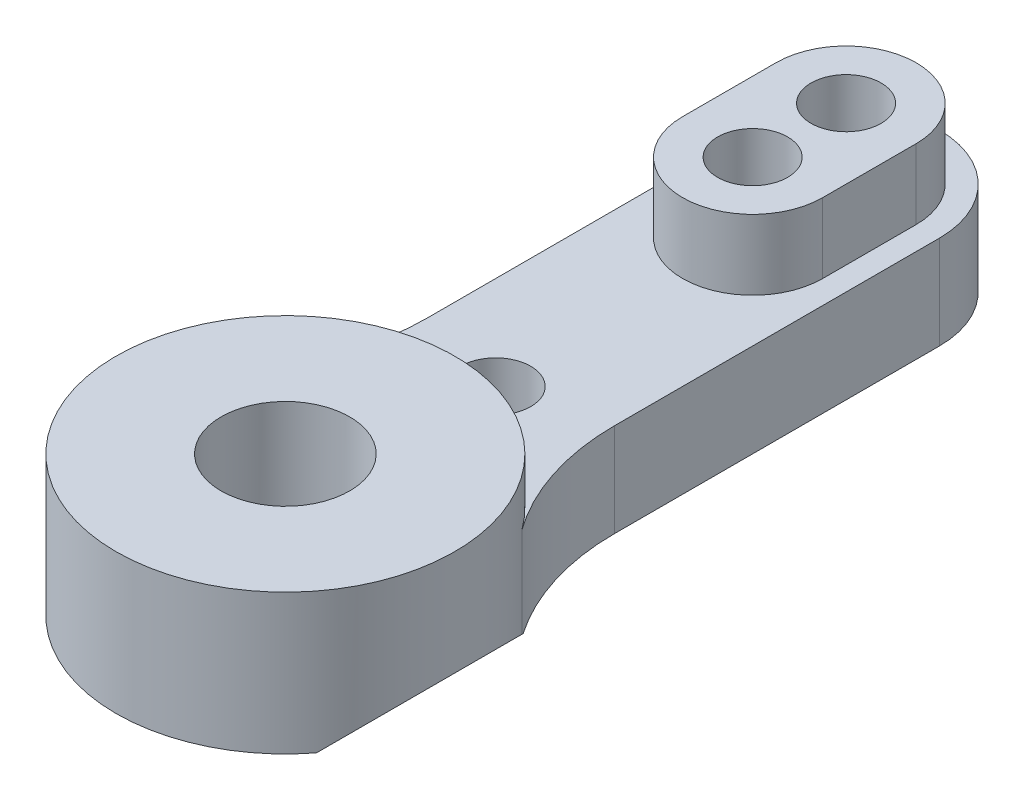
ISO-10303-21;
HEADER;
FILE_DESCRIPTION(('STEP AP214'),'2;1');
FILE_NAME('part.step','',(''),(''),'','','');
FILE_SCHEMA(('AUTOMOTIVE_DESIGN { 1 0 10303 214 1 1 1 1 }'));
ENDSEC;
DATA;
#1=APPLICATION_CONTEXT('core data for automotive mechanical design processes');
#2=APPLICATION_PROTOCOL_DEFINITION('international standard','automotive_design',2000,#1);
#3=PRODUCT_CONTEXT('',#1,'mechanical');
#4=PRODUCT('Part','Part','',(#3));
#5=PRODUCT_RELATED_PRODUCT_CATEGORY('part','',(#4));
#6=PRODUCT_DEFINITION_FORMATION('','',#4);
#7=PRODUCT_DEFINITION_CONTEXT('part definition',#1,'design');
#8=PRODUCT_DEFINITION('design','',#6,#7);
#9=PRODUCT_DEFINITION_SHAPE('','',#8);
#10=(LENGTH_UNIT() NAMED_UNIT(*) SI_UNIT(.MILLI.,.METRE.));
#11=(NAMED_UNIT(*) PLANE_ANGLE_UNIT() SI_UNIT($,.RADIAN.));
#12=(NAMED_UNIT(*) SI_UNIT($,.STERADIAN.) SOLID_ANGLE_UNIT());
#13=UNCERTAINTY_MEASURE_WITH_UNIT(LENGTH_MEASURE(1.E-05),#10,'distance_accuracy_value','');
#14=(GEOMETRIC_REPRESENTATION_CONTEXT(3) GLOBAL_UNCERTAINTY_ASSIGNED_CONTEXT((#13)) GLOBAL_UNIT_ASSIGNED_CONTEXT((#10,
#11,#12)) REPRESENTATION_CONTEXT('',''));
#15=CARTESIAN_POINT('',(0.,0.,0.));
#16=DIRECTION('',(0.,0.,1.));
#17=DIRECTION('',(1.,0.,0.));
#18=AXIS2_PLACEMENT_3D('',#15,#16,#17);
#19=CARTESIAN_POINT('',(0.,2.,12.));
#20=DIRECTION('',(0.,-1.,0.));
#21=DIRECTION('',(0.,0.,-1.));
#22=AXIS2_PLACEMENT_3D('',#19,#20,#21);
#23=CYLINDRICAL_SURFACE('',#22,7.25);
#24=CARTESIAN_POINT('',(0.,4.,12.));
#25=DIRECTION('',(0.,1.,0.));
#26=DIRECTION('',(0.,0.,1.));
#27=AXIS2_PLACEMENT_3D('',#24,#25,#26);
#28=CIRCLE('',#27,7.25);
#29=CARTESIAN_POINT('',(0.,4.,19.25));
#30=VERTEX_POINT('',#29);
#31=EDGE_CURVE('E141',#30,#30,#28,.T.);
#32=ORIENTED_EDGE('',*,*,#31,.F.);
#33=EDGE_LOOP('',(#32));
#34=FACE_BOUND('',#33,.T.);
#35=CARTESIAN_POINT('',(0.,-7.75,12.));
#36=DIRECTION('',(-0.707106781186548,-0.707106781186547,0.));
#37=DIRECTION('',(0.707106781186547,-0.707106781186548,0.));
#38=AXIS2_PLACEMENT_3D('',#35,#36,#37);
#39=ELLIPSE('',#38,10.2530483272049,7.25);
#40=CARTESIAN_POINT('',(-5.75000000000001,-2.,16.4158804331639));
#41=VERTEX_POINT('',#40);
#42=CARTESIAN_POINT('',(-5.88405797101449,-1.86594202898551,7.76439357426344));
#43=VERTEX_POINT('',#42);
#44=EDGE_CURVE('E51',#41,#43,#39,.T.);
#45=ORIENTED_EDGE('',*,*,#44,.F.);
#46=CARTESIAN_POINT('',(0.,-2.,12.));
#47=DIRECTION('',(0.,1.,0.));
#48=DIRECTION('',(0.,0.,1.));
#49=AXIS2_PLACEMENT_3D('',#46,#47,#48);
#50=CIRCLE('',#49,7.25);
#51=CARTESIAN_POINT('',(5.75,-2.,16.4158804331639));
#52=VERTEX_POINT('',#51);
#53=EDGE_CURVE('E135',#41,#52,#50,.T.);
#54=ORIENTED_EDGE('',*,*,#53,.T.);
#55=CARTESIAN_POINT('',(0.,-7.75,12.));
#56=DIRECTION('',(0.707106781186548,-0.707106781186547,0.));
#57=DIRECTION('',(-0.707106781186547,-0.707106781186548,0.));
#58=AXIS2_PLACEMENT_3D('',#55,#56,#57);
#59=ELLIPSE('',#58,10.2530483272049,7.25);
#60=CARTESIAN_POINT('',(5.88405797101449,-1.86594202898551,7.76439357426345));
#61=VERTEX_POINT('',#60);
#62=EDGE_CURVE('E123',#61,#52,#59,.T.);
#63=ORIENTED_EDGE('',*,*,#62,.F.);
#64=DIRECTION('',(0.,-1.,0.));
#65=VECTOR('',#64,1.);
#66=CARTESIAN_POINT('',(5.88405797101449,2.,7.76439357426345));
#67=LINE('',#66,#65);
#68=CARTESIAN_POINT('',(5.88405797101449,2.,7.76439357426345));
#69=VERTEX_POINT('',#68);
#70=EDGE_CURVE('E163',#61,#69,#67,.F.);
#71=ORIENTED_EDGE('',*,*,#70,.T.);
#72=CARTESIAN_POINT('',(0.,2.,12.));
#73=DIRECTION('',(0.,1.,0.));
#74=DIRECTION('',(0.,0.,1.));
#75=AXIS2_PLACEMENT_3D('',#72,#73,#74);
#76=CIRCLE('',#75,7.25);
#77=CARTESIAN_POINT('',(-5.8840579710145,2.,7.76439357426344));
#78=VERTEX_POINT('',#77);
#79=EDGE_CURVE('E146',#69,#78,#76,.T.);
#80=ORIENTED_EDGE('',*,*,#79,.T.);
#81=DIRECTION('',(0.,-1.,0.));
#82=VECTOR('',#81,1.);
#83=CARTESIAN_POINT('',(-5.88405797101449,2.,7.76439357426344));
#84=LINE('',#83,#82);
#85=EDGE_CURVE('E170',#78,#43,#84,.T.);
#86=ORIENTED_EDGE('',*,*,#85,.T.);
#87=EDGE_LOOP('',(#45,#54,#63,#71,#80,#86));
#88=FACE_BOUND('',#87,.T.);
#89=ADVANCED_FACE('F37',(#34,#88),#23,.T.);
#90=CARTESIAN_POINT('',(0.,-2.,12.));
#91=DIRECTION('',(0.,1.,0.));
#92=DIRECTION('',(0.,0.,1.));
#93=AXIS2_PLACEMENT_3D('',#90,#91,#92);
#94=PLANE('',#93);
#95=CARTESIAN_POINT('',(0.,-2.,-12.));
#96=DIRECTION('',(0.,-1.,0.));
#97=DIRECTION('',(0.,0.,-1.));
#98=AXIS2_PLACEMENT_3D('',#95,#96,#97);
#99=CIRCLE('',#98,1.5);
#100=CARTESIAN_POINT('',(0.,-2.,-13.5));
#101=VERTEX_POINT('',#100);
#102=EDGE_CURVE('E218',#101,#101,#99,.T.);
#103=ORIENTED_EDGE('',*,*,#102,.F.);
#104=EDGE_LOOP('',(#103));
#105=FACE_BOUND('',#104,.T.);
#106=CARTESIAN_POINT('',(0.,-2.,-8.));
#107=DIRECTION('',(0.,-1.,0.));
#108=DIRECTION('',(0.,0.,-1.));
#109=AXIS2_PLACEMENT_3D('',#106,#107,#108);
#110=CIRCLE('',#109,1.5);
#111=CARTESIAN_POINT('',(0.,-2.,-9.5));
#112=VERTEX_POINT('',#111);
#113=EDGE_CURVE('E224',#112,#112,#110,.T.);
#114=ORIENTED_EDGE('',*,*,#113,.F.);
#115=EDGE_LOOP('',(#114));
#116=FACE_BOUND('',#115,.T.);
#117=CARTESIAN_POINT('',(0.,-2.,3.));
#118=DIRECTION('',(0.,-1.,0.));
#119=DIRECTION('',(0.,0.,-1.));
#120=AXIS2_PLACEMENT_3D('',#117,#118,#119);
#121=CIRCLE('',#120,1.5);
#122=CARTESIAN_POINT('',(0.,-2.,1.5));
#123=VERTEX_POINT('',#122);
#124=EDGE_CURVE('E213',#123,#123,#121,.T.);
#125=ORIENTED_EDGE('',*,*,#124,.F.);
#126=EDGE_LOOP('',(#125));
#127=FACE_BOUND('',#126,.T.);
#128=CARTESIAN_POINT('',(0.,-2.,12.));
#129=DIRECTION('',(0.,-1.,0.));
#130=DIRECTION('',(0.,0.,-1.));
#131=AXIS2_PLACEMENT_3D('',#128,#129,#130);
#132=CIRCLE('',#131,4.);
#133=CARTESIAN_POINT('',(0.,-2.,8.));
#134=VERTEX_POINT('',#133);
#135=EDGE_CURVE('E231',#134,#134,#132,.T.);
#136=ORIENTED_EDGE('',*,*,#135,.F.);
#137=EDGE_LOOP('',(#136));
#138=FACE_BOUND('',#137,.T.);
#139=DIRECTION('',(0.,0.,-1.));
#140=VECTOR('',#139,1.);
#141=CARTESIAN_POINT('',(-5.75000000000001,-2.,18.));
#142=LINE('',#141,#140);
#143=CARTESIAN_POINT('',(-5.75000000000001,-2.,7.57350509235547));
#144=VERTEX_POINT('',#143);
#145=EDGE_CURVE('E128',#41,#144,#142,.T.);
#146=ORIENTED_EDGE('',*,*,#145,.T.);
#147=CARTESIAN_POINT('',(-14.,-2.,1.9221778146268));
#148=DIRECTION('',(0.,1.,0.));
#149=DIRECTION('',(0.,0.,1.));
#150=AXIS2_PLACEMENT_3D('',#147,#148,#149);
#151=CIRCLE('',#150,10.);
#152=CARTESIAN_POINT('',(-4.,-2.,1.9221778146268));
#153=VERTEX_POINT('',#152);
#154=EDGE_CURVE('E177',#144,#153,#151,.T.);
#155=ORIENTED_EDGE('',*,*,#154,.T.);
#156=DIRECTION('',(0.,0.,1.));
#157=VECTOR('',#156,1.);
#158=CARTESIAN_POINT('',(-4.,-2.,5.95330668877608));
#159=LINE('',#158,#157);
#160=CARTESIAN_POINT('',(-4.,-2.,-12.));
#161=VERTEX_POINT('',#160);
#162=EDGE_CURVE('E153',#161,#153,#159,.T.);
#163=ORIENTED_EDGE('',*,*,#162,.F.);
#164=CARTESIAN_POINT('',(0.,-2.,-12.));
#165=DIRECTION('',(0.,1.,0.));
#166=DIRECTION('',(0.,0.,-1.));
#167=AXIS2_PLACEMENT_3D('',#164,#165,#166);
#168=CIRCLE('',#167,4.);
#169=CARTESIAN_POINT('',(4.,-2.,-12.));
#170=VERTEX_POINT('',#169);
#171=EDGE_CURVE('E143',#170,#161,#168,.T.);
#172=ORIENTED_EDGE('',*,*,#171,.F.);
#173=DIRECTION('',(0.,0.,-1.));
#174=VECTOR('',#173,1.);
#175=CARTESIAN_POINT('',(4.,-2.,-12.));
#176=LINE('',#175,#174);
#177=CARTESIAN_POINT('',(4.,-2.,1.92217781462682));
#178=VERTEX_POINT('',#177);
#179=EDGE_CURVE('E140',#178,#170,#176,.T.);
#180=ORIENTED_EDGE('',*,*,#179,.F.);
#181=CARTESIAN_POINT('',(14.,-2.,1.92217781462682));
#182=DIRECTION('',(0.,1.,0.));
#183=DIRECTION('',(0.,0.,1.));
#184=AXIS2_PLACEMENT_3D('',#181,#182,#183);
#185=CIRCLE('',#184,10.);
#186=CARTESIAN_POINT('',(5.75,-2.,7.57350509235547));
#187=VERTEX_POINT('',#186);
#188=EDGE_CURVE('E137',#178,#187,#185,.T.);
#189=ORIENTED_EDGE('',*,*,#188,.T.);
#190=DIRECTION('',(0.,0.,-1.));
#191=VECTOR('',#190,1.);
#192=CARTESIAN_POINT('',(5.75,-2.,18.));
#193=LINE('',#192,#191);
#194=EDGE_CURVE('E59',#52,#187,#193,.T.);
#195=ORIENTED_EDGE('',*,*,#194,.F.);
#196=ORIENTED_EDGE('',*,*,#53,.F.);
#197=EDGE_LOOP('',(#146,#155,#163,#172,#180,#189,#195,#196));
#198=FACE_BOUND('',#197,.T.);
#199=ADVANCED_FACE('F134',(#105,#116,#127,#138,#198),#94,.F.);
#200=CARTESIAN_POINT('',(-14.,2.,1.9221778146268));
#201=DIRECTION('',(0.,-1.,0.));
#202=DIRECTION('',(0.,0.,-1.));
#203=AXIS2_PLACEMENT_3D('',#200,#201,#202);
#204=CYLINDRICAL_SURFACE('',#203,10.);
#205=CARTESIAN_POINT('',(-14.,6.25,1.9221778146268));
#206=DIRECTION('',(-0.707106781186548,-0.707106781186547,0.));
#207=DIRECTION('',(0.707106781186547,-0.707106781186548,0.));
#208=AXIS2_PLACEMENT_3D('',#205,#206,#207);
#209=ELLIPSE('',#208,14.142135623731,10.);
#210=EDGE_CURVE('E11',#43,#144,#209,.F.);
#211=ORIENTED_EDGE('',*,*,#210,.F.);
#212=ORIENTED_EDGE('',*,*,#85,.F.);
#213=CARTESIAN_POINT('',(-14.,2.,1.9221778146268));
#214=DIRECTION('',(0.,1.,0.));
#215=DIRECTION('',(0.,0.,1.));
#216=AXIS2_PLACEMENT_3D('',#213,#214,#215);
#217=CIRCLE('',#216,10.);
#218=CARTESIAN_POINT('',(-4.,2.,1.9221778146268));
#219=VERTEX_POINT('',#218);
#220=EDGE_CURVE('E179',#219,#78,#217,.F.);
#221=ORIENTED_EDGE('',*,*,#220,.F.);
#222=DIRECTION('',(0.,1.,0.));
#223=VECTOR('',#222,1.);
#224=CARTESIAN_POINT('',(-4.,2.,1.9221778146268));
#225=LINE('',#224,#223);
#226=EDGE_CURVE('E172',#153,#219,#225,.T.);
#227=ORIENTED_EDGE('',*,*,#226,.F.);
#228=ORIENTED_EDGE('',*,*,#154,.F.);
#229=EDGE_LOOP('',(#211,#212,#221,#227,#228));
#230=FACE_BOUND('',#229,.T.);
#231=ADVANCED_FACE('F206',(#230),#204,.F.);
#232=CARTESIAN_POINT('',(14.,2.,1.92217781462682));
#233=DIRECTION('',(0.,-1.,0.));
#234=DIRECTION('',(0.,0.,-1.));
#235=AXIS2_PLACEMENT_3D('',#232,#233,#234);
#236=CYLINDRICAL_SURFACE('',#235,10.);
#237=CARTESIAN_POINT('',(14.,6.25000000000001,1.92217781462682));
#238=DIRECTION('',(0.707106781186548,-0.707106781186547,0.));
#239=DIRECTION('',(-0.707106781186547,-0.707106781186548,0.));
#240=AXIS2_PLACEMENT_3D('',#237,#238,#239);
#241=ELLIPSE('',#240,14.142135623731,10.);
#242=EDGE_CURVE('E45',#187,#61,#241,.F.);
#243=ORIENTED_EDGE('',*,*,#242,.F.);
#244=ORIENTED_EDGE('',*,*,#188,.F.);
#245=DIRECTION('',(0.,1.,0.));
#246=VECTOR('',#245,1.);
#247=CARTESIAN_POINT('',(4.,-2.,1.92217781462682));
#248=LINE('',#247,#246);
#249=CARTESIAN_POINT('',(4.,2.,1.92217781462682));
#250=VERTEX_POINT('',#249);
#251=EDGE_CURVE('E174',#250,#178,#248,.F.);
#252=ORIENTED_EDGE('',*,*,#251,.F.);
#253=CARTESIAN_POINT('',(14.,2.,1.92217781462682));
#254=DIRECTION('',(0.,1.,0.));
#255=DIRECTION('',(0.,0.,1.));
#256=AXIS2_PLACEMENT_3D('',#253,#254,#255);
#257=CIRCLE('',#256,10.);
#258=EDGE_CURVE('E183',#69,#250,#257,.F.);
#259=ORIENTED_EDGE('',*,*,#258,.F.);
#260=ORIENTED_EDGE('',*,*,#70,.F.);
#261=EDGE_LOOP('',(#243,#244,#252,#259,#260));
#262=FACE_BOUND('',#261,.T.);
#263=ADVANCED_FACE('F39',(#262),#236,.F.);
#264=CARTESIAN_POINT('',(0.,-2.,12.));
#265=DIRECTION('',(0.,1.,0.));
#266=DIRECTION('',(0.,0.,1.));
#267=AXIS2_PLACEMENT_3D('',#264,#265,#266);
#268=CYLINDRICAL_SURFACE('',#267,2.75);
#269=CARTESIAN_POINT('',(0.,4.,12.));
#270=DIRECTION('',(0.,1.,0.));
#271=DIRECTION('',(0.,0.,1.));
#272=AXIS2_PLACEMENT_3D('',#269,#270,#271);
#273=CIRCLE('',#272,2.75);
#274=CARTESIAN_POINT('',(0.,4.,14.75));
#275=VERTEX_POINT('',#274);
#276=EDGE_CURVE('E167',#275,#275,#273,.T.);
#277=ORIENTED_EDGE('',*,*,#276,.T.);
#278=EDGE_LOOP('',(#277));
#279=FACE_BOUND('',#278,.T.);
#280=CARTESIAN_POINT('',(0.,-1.,12.));
#281=DIRECTION('',(0.,-1.,0.));
#282=DIRECTION('',(0.,0.,-1.));
#283=AXIS2_PLACEMENT_3D('',#280,#281,#282);
#284=CIRCLE('',#283,2.75);
#285=CARTESIAN_POINT('',(0.,-1.,9.25));
#286=VERTEX_POINT('',#285);
#287=EDGE_CURVE('E164',#286,#286,#284,.F.);
#288=ORIENTED_EDGE('',*,*,#287,.F.);
#289=EDGE_LOOP('',(#288));
#290=FACE_BOUND('',#289,.T.);
#291=ADVANCED_FACE('F296',(#279,#290),#268,.F.);
#292=CARTESIAN_POINT('',(0.,2.,12.));
#293=DIRECTION('',(0.,1.,0.));
#294=DIRECTION('',(0.,0.,1.));
#295=AXIS2_PLACEMENT_3D('',#292,#293,#294);
#296=PLANE('',#295);
#297=CARTESIAN_POINT('',(0.,2.,3.));
#298=DIRECTION('',(0.,1.,0.));
#299=DIRECTION('',(0.,0.,1.));
#300=AXIS2_PLACEMENT_3D('',#297,#298,#299);
#301=CIRCLE('',#300,1.5);
#302=CARTESIAN_POINT('',(0.,2.,4.5));
#303=VERTEX_POINT('',#302);
#304=EDGE_CURVE('E217',#303,#303,#301,.T.);
#305=ORIENTED_EDGE('',*,*,#304,.F.);
#306=EDGE_LOOP('',(#305));
#307=FACE_BOUND('',#306,.T.);
#308=ORIENTED_EDGE('',*,*,#79,.F.);
#309=ORIENTED_EDGE('',*,*,#258,.T.);
#310=DIRECTION('',(0.,0.,-1.));
#311=VECTOR('',#310,1.);
#312=CARTESIAN_POINT('',(4.,2.,-12.));
#313=LINE('',#312,#311);
#314=CARTESIAN_POINT('',(4.,2.,-12.));
#315=VERTEX_POINT('',#314);
#316=EDGE_CURVE('E156',#250,#315,#313,.T.);
#317=ORIENTED_EDGE('',*,*,#316,.T.);
#318=CARTESIAN_POINT('',(0.,2.,-12.));
#319=DIRECTION('',(0.,1.,0.));
#320=DIRECTION('',(0.,0.,-1.));
#321=AXIS2_PLACEMENT_3D('',#318,#319,#320);
#322=CIRCLE('',#321,4.);
#323=CARTESIAN_POINT('',(-4.,2.,-12.));
#324=VERTEX_POINT('',#323);
#325=EDGE_CURVE('E196',#315,#324,#322,.T.);
#326=ORIENTED_EDGE('',*,*,#325,.T.);
#327=DIRECTION('',(0.,0.,1.));
#328=VECTOR('',#327,1.);
#329=CARTESIAN_POINT('',(-4.,2.,5.95330668877608));
#330=LINE('',#329,#328);
#331=EDGE_CURVE('E149',#324,#219,#330,.T.);
#332=ORIENTED_EDGE('',*,*,#331,.T.);
#333=ORIENTED_EDGE('',*,*,#220,.T.);
#334=EDGE_LOOP('',(#308,#309,#317,#326,#332,#333));
#335=FACE_BOUND('',#334,.T.);
#336=DIRECTION('',(0.,0.,1.));
#337=VECTOR('',#336,1.);
#338=CARTESIAN_POINT('',(-3.,2.,-12.));
#339=LINE('',#338,#337);
#340=CARTESIAN_POINT('',(-3.,2.,-12.));
#341=VERTEX_POINT('',#340);
#342=CARTESIAN_POINT('',(-3.,2.,-8.));
#343=VERTEX_POINT('',#342);
#344=EDGE_CURVE('E252',#341,#343,#339,.T.);
#345=ORIENTED_EDGE('',*,*,#344,.F.);
#346=CARTESIAN_POINT('',(0.,2.,-12.));
#347=DIRECTION('',(0.,1.,0.));
#348=DIRECTION('',(0.,0.,-1.));
#349=AXIS2_PLACEMENT_3D('',#346,#347,#348);
#350=CIRCLE('',#349,3.);
#351=CARTESIAN_POINT('',(3.,2.,-12.));
#352=VERTEX_POINT('',#351);
#353=EDGE_CURVE('E238',#352,#341,#350,.T.);
#354=ORIENTED_EDGE('',*,*,#353,.F.);
#355=DIRECTION('',(0.,0.,-1.));
#356=VECTOR('',#355,1.);
#357=CARTESIAN_POINT('',(3.,2.,-12.));
#358=LINE('',#357,#356);
#359=CARTESIAN_POINT('',(3.,2.,-8.00000000000001));
#360=VERTEX_POINT('',#359);
#361=EDGE_CURVE('E243',#360,#352,#358,.T.);
#362=ORIENTED_EDGE('',*,*,#361,.F.);
#363=CARTESIAN_POINT('',(0.,2.,-8.));
#364=DIRECTION('',(0.,1.,0.));
#365=DIRECTION('',(0.,0.,1.));
#366=AXIS2_PLACEMENT_3D('',#363,#364,#365);
#367=CIRCLE('',#366,3.);
#368=EDGE_CURVE('E254',#343,#360,#367,.T.);
#369=ORIENTED_EDGE('',*,*,#368,.F.);
#370=EDGE_LOOP('',(#345,#354,#362,#369));
#371=FACE_BOUND('',#370,.T.);
#372=ADVANCED_FACE('F188',(#307,#335,#371),#296,.T.);
#373=CARTESIAN_POINT('',(4.,2.,-12.));
#374=DIRECTION('',(-1.,0.,0.));
#375=DIRECTION('',(0.,0.,1.));
#376=AXIS2_PLACEMENT_3D('',#373,#374,#375);
#377=PLANE('',#376);
#378=ORIENTED_EDGE('',*,*,#316,.F.);
#379=ORIENTED_EDGE('',*,*,#251,.T.);
#380=ORIENTED_EDGE('',*,*,#179,.T.);
#381=DIRECTION('',(0.,-1.,0.));
#382=VECTOR('',#381,1.);
#383=CARTESIAN_POINT('',(4.,2.,-12.));
#384=LINE('',#383,#382);
#385=EDGE_CURVE('E160',#315,#170,#384,.T.);
#386=ORIENTED_EDGE('',*,*,#385,.F.);
#387=EDGE_LOOP('',(#378,#379,#380,#386));
#388=FACE_BOUND('',#387,.T.);
#389=ADVANCED_FACE('F194',(#388),#377,.F.);
#390=CARTESIAN_POINT('',(0.,2.,-12.));
#391=DIRECTION('',(0.,-1.,0.));
#392=DIRECTION('',(0.,0.,-1.));
#393=AXIS2_PLACEMENT_3D('',#390,#391,#392);
#394=CYLINDRICAL_SURFACE('',#393,4.);
#395=ORIENTED_EDGE('',*,*,#171,.T.);
#396=DIRECTION('',(0.,-1.,0.));
#397=VECTOR('',#396,1.);
#398=CARTESIAN_POINT('',(-4.,2.,-12.));
#399=LINE('',#398,#397);
#400=EDGE_CURVE('E157',#324,#161,#399,.T.);
#401=ORIENTED_EDGE('',*,*,#400,.F.);
#402=ORIENTED_EDGE('',*,*,#325,.F.);
#403=ORIENTED_EDGE('',*,*,#385,.T.);
#404=EDGE_LOOP('',(#395,#401,#402,#403));
#405=FACE_BOUND('',#404,.T.);
#406=ADVANCED_FACE('F267',(#405),#394,.T.);
#407=CARTESIAN_POINT('',(-4.,2.,5.95330668877608));
#408=DIRECTION('',(1.,0.,0.));
#409=DIRECTION('',(0.,0.,-1.));
#410=AXIS2_PLACEMENT_3D('',#407,#408,#409);
#411=PLANE('',#410);
#412=ORIENTED_EDGE('',*,*,#162,.T.);
#413=ORIENTED_EDGE('',*,*,#226,.T.);
#414=ORIENTED_EDGE('',*,*,#331,.F.);
#415=ORIENTED_EDGE('',*,*,#400,.T.);
#416=EDGE_LOOP('',(#412,#413,#414,#415));
#417=FACE_BOUND('',#416,.T.);
#418=ADVANCED_FACE('F270',(#417),#411,.F.);
#419=CARTESIAN_POINT('',(0.,4.,12.));
#420=DIRECTION('',(0.,1.,0.));
#421=DIRECTION('',(0.,0.,1.));
#422=AXIS2_PLACEMENT_3D('',#419,#420,#421);
#423=PLANE('',#422);
#424=ORIENTED_EDGE('',*,*,#276,.F.);
#425=EDGE_LOOP('',(#424));
#426=FACE_BOUND('',#425,.T.);
#427=ORIENTED_EDGE('',*,*,#31,.T.);
#428=EDGE_LOOP('',(#427));
#429=FACE_BOUND('',#428,.T.);
#430=ADVANCED_FACE('F272',(#426,#429),#423,.T.);
#431=CARTESIAN_POINT('',(0.,5.,-12.));
#432=DIRECTION('',(0.,-1.,0.));
#433=DIRECTION('',(0.,0.,-1.));
#434=AXIS2_PLACEMENT_3D('',#431,#432,#433);
#435=CYLINDRICAL_SURFACE('',#434,3.);
#436=ORIENTED_EDGE('',*,*,#353,.T.);
#437=DIRECTION('',(0.,-1.,0.));
#438=VECTOR('',#437,1.);
#439=CARTESIAN_POINT('',(-3.,5.,-12.));
#440=LINE('',#439,#438);
#441=CARTESIAN_POINT('',(-3.,5.,-12.));
#442=VERTEX_POINT('',#441);
#443=EDGE_CURVE('E199',#442,#341,#440,.T.);
#444=ORIENTED_EDGE('',*,*,#443,.F.);
#445=CARTESIAN_POINT('',(0.,5.,-12.));
#446=DIRECTION('',(0.,1.,0.));
#447=DIRECTION('',(0.,0.,-1.));
#448=AXIS2_PLACEMENT_3D('',#445,#446,#447);
#449=CIRCLE('',#448,3.);
#450=CARTESIAN_POINT('',(3.,5.,-12.));
#451=VERTEX_POINT('',#450);
#452=EDGE_CURVE('E239',#451,#442,#449,.T.);
#453=ORIENTED_EDGE('',*,*,#452,.F.);
#454=DIRECTION('',(0.,-1.,0.));
#455=VECTOR('',#454,1.);
#456=CARTESIAN_POINT('',(3.,5.,-12.));
#457=LINE('',#456,#455);
#458=EDGE_CURVE('E249',#451,#352,#457,.T.);
#459=ORIENTED_EDGE('',*,*,#458,.T.);
#460=EDGE_LOOP('',(#436,#444,#453,#459));
#461=FACE_BOUND('',#460,.T.);
#462=ADVANCED_FACE('F278',(#461),#435,.T.);
#463=CARTESIAN_POINT('',(-3.,5.,-12.));
#464=DIRECTION('',(1.,0.,0.));
#465=DIRECTION('',(0.,0.,-1.));
#466=AXIS2_PLACEMENT_3D('',#463,#464,#465);
#467=PLANE('',#466);
#468=ORIENTED_EDGE('',*,*,#344,.T.);
#469=DIRECTION('',(0.,-1.,0.));
#470=VECTOR('',#469,1.);
#471=CARTESIAN_POINT('',(-3.,5.,-8.));
#472=LINE('',#471,#470);
#473=CARTESIAN_POINT('',(-3.,5.,-8.));
#474=VERTEX_POINT('',#473);
#475=EDGE_CURVE('E262',#474,#343,#472,.T.);
#476=ORIENTED_EDGE('',*,*,#475,.F.);
#477=DIRECTION('',(0.,0.,1.));
#478=VECTOR('',#477,1.);
#479=CARTESIAN_POINT('',(-3.,5.,-12.));
#480=LINE('',#479,#478);
#481=EDGE_CURVE('E242',#442,#474,#480,.T.);
#482=ORIENTED_EDGE('',*,*,#481,.F.);
#483=ORIENTED_EDGE('',*,*,#443,.T.);
#484=EDGE_LOOP('',(#468,#476,#482,#483));
#485=FACE_BOUND('',#484,.T.);
#486=ADVANCED_FACE('F324',(#485),#467,.F.);
#487=CARTESIAN_POINT('',(0.,5.,-8.));
#488=DIRECTION('',(0.,-1.,0.));
#489=DIRECTION('',(0.,0.,-1.));
#490=AXIS2_PLACEMENT_3D('',#487,#488,#489);
#491=CYLINDRICAL_SURFACE('',#490,3.);
#492=ORIENTED_EDGE('',*,*,#368,.T.);
#493=DIRECTION('',(0.,-1.,0.));
#494=VECTOR('',#493,1.);
#495=CARTESIAN_POINT('',(3.,5.,-8.));
#496=LINE('',#495,#494);
#497=CARTESIAN_POINT('',(3.,5.,-8.));
#498=VERTEX_POINT('',#497);
#499=EDGE_CURVE('E260',#498,#360,#496,.T.);
#500=ORIENTED_EDGE('',*,*,#499,.F.);
#501=CARTESIAN_POINT('',(0.,5.,-8.));
#502=DIRECTION('',(0.,1.,0.));
#503=DIRECTION('',(0.,0.,1.));
#504=AXIS2_PLACEMENT_3D('',#501,#502,#503);
#505=CIRCLE('',#504,3.);
#506=EDGE_CURVE('E245',#474,#498,#505,.T.);
#507=ORIENTED_EDGE('',*,*,#506,.F.);
#508=ORIENTED_EDGE('',*,*,#475,.T.);
#509=EDGE_LOOP('',(#492,#500,#507,#508));
#510=FACE_BOUND('',#509,.T.);
#511=ADVANCED_FACE('F320',(#510),#491,.T.);
#512=CARTESIAN_POINT('',(3.,5.,-12.));
#513=DIRECTION('',(-1.,0.,0.));
#514=DIRECTION('',(0.,0.,1.));
#515=AXIS2_PLACEMENT_3D('',#512,#513,#514);
#516=PLANE('',#515);
#517=ORIENTED_EDGE('',*,*,#361,.T.);
#518=ORIENTED_EDGE('',*,*,#458,.F.);
#519=DIRECTION('',(0.,0.,-1.));
#520=VECTOR('',#519,1.);
#521=CARTESIAN_POINT('',(3.,5.,-12.));
#522=LINE('',#521,#520);
#523=EDGE_CURVE('E247',#498,#451,#522,.T.);
#524=ORIENTED_EDGE('',*,*,#523,.F.);
#525=ORIENTED_EDGE('',*,*,#499,.T.);
#526=EDGE_LOOP('',(#517,#518,#524,#525));
#527=FACE_BOUND('',#526,.T.);
#528=ADVANCED_FACE('F316',(#527),#516,.F.);
#529=CARTESIAN_POINT('',(0.,5.,-12.));
#530=DIRECTION('',(0.,-1.,0.));
#531=DIRECTION('',(0.,0.,-1.));
#532=AXIS2_PLACEMENT_3D('',#529,#530,#531);
#533=PLANE('',#532);
#534=CARTESIAN_POINT('',(0.,5.,-12.));
#535=DIRECTION('',(0.,-1.,0.));
#536=DIRECTION('',(0.,0.,-1.));
#537=AXIS2_PLACEMENT_3D('',#534,#535,#536);
#538=CIRCLE('',#537,1.5);
#539=CARTESIAN_POINT('',(0.,5.,-13.5));
#540=VERTEX_POINT('',#539);
#541=EDGE_CURVE('E214',#540,#540,#538,.T.);
#542=ORIENTED_EDGE('',*,*,#541,.T.);
#543=EDGE_LOOP('',(#542));
#544=FACE_BOUND('',#543,.T.);
#545=CARTESIAN_POINT('',(0.,5.,-8.));
#546=DIRECTION('',(0.,-1.,0.));
#547=DIRECTION('',(0.,0.,-1.));
#548=AXIS2_PLACEMENT_3D('',#545,#546,#547);
#549=CIRCLE('',#548,1.5);
#550=CARTESIAN_POINT('',(0.,5.,-9.5));
#551=VERTEX_POINT('',#550);
#552=EDGE_CURVE('E221',#551,#551,#549,.T.);
#553=ORIENTED_EDGE('',*,*,#552,.T.);
#554=EDGE_LOOP('',(#553));
#555=FACE_BOUND('',#554,.T.);
#556=ORIENTED_EDGE('',*,*,#452,.T.);
#557=ORIENTED_EDGE('',*,*,#481,.T.);
#558=ORIENTED_EDGE('',*,*,#506,.T.);
#559=ORIENTED_EDGE('',*,*,#523,.T.);
#560=EDGE_LOOP('',(#556,#557,#558,#559));
#561=FACE_BOUND('',#560,.T.);
#562=ADVANCED_FACE('F312',(#544,#555,#561),#533,.F.);
#563=CARTESIAN_POINT('',(0.,-1.,12.));
#564=DIRECTION('',(0.,-1.,0.));
#565=DIRECTION('',(0.,0.,-1.));
#566=AXIS2_PLACEMENT_3D('',#563,#564,#565);
#567=PLANE('',#566);
#568=CARTESIAN_POINT('',(0.,-1.,12.));
#569=DIRECTION('',(0.,-1.,0.));
#570=DIRECTION('',(0.,0.,-1.));
#571=AXIS2_PLACEMENT_3D('',#568,#569,#570);
#572=CIRCLE('',#571,4.);
#573=CARTESIAN_POINT('',(0.,-1.,8.));
#574=VERTEX_POINT('',#573);
#575=EDGE_CURVE('E168',#574,#574,#572,.T.);
#576=ORIENTED_EDGE('',*,*,#575,.T.);
#577=EDGE_LOOP('',(#576));
#578=FACE_BOUND('',#577,.T.);
#579=ORIENTED_EDGE('',*,*,#287,.T.);
#580=EDGE_LOOP('',(#579));
#581=FACE_BOUND('',#580,.T.);
#582=ADVANCED_FACE('F315',(#578,#581),#567,.T.);
#583=CARTESIAN_POINT('',(0.,-1.,12.));
#584=DIRECTION('',(0.,-1.,0.));
#585=DIRECTION('',(0.,0.,-1.));
#586=AXIS2_PLACEMENT_3D('',#583,#584,#585);
#587=CYLINDRICAL_SURFACE('',#586,4.);
#588=ORIENTED_EDGE('',*,*,#575,.F.);
#589=EDGE_LOOP('',(#588));
#590=FACE_BOUND('',#589,.T.);
#591=ORIENTED_EDGE('',*,*,#135,.T.);
#592=EDGE_LOOP('',(#591));
#593=FACE_BOUND('',#592,.T.);
#594=ADVANCED_FACE('F310',(#590,#593),#587,.F.);
#595=CARTESIAN_POINT('',(0.,5.,-8.));
#596=DIRECTION('',(0.,-1.,0.));
#597=DIRECTION('',(0.,0.,-1.));
#598=AXIS2_PLACEMENT_3D('',#595,#596,#597);
#599=CYLINDRICAL_SURFACE('',#598,1.5);
#600=ORIENTED_EDGE('',*,*,#552,.F.);
#601=EDGE_LOOP('',(#600));
#602=FACE_BOUND('',#601,.T.);
#603=ORIENTED_EDGE('',*,*,#113,.T.);
#604=EDGE_LOOP('',(#603));
#605=FACE_BOUND('',#604,.T.);
#606=ADVANCED_FACE('F377',(#602,#605),#599,.F.);
#607=CARTESIAN_POINT('',(0.,5.,-12.));
#608=DIRECTION('',(0.,-1.,0.));
#609=DIRECTION('',(0.,0.,-1.));
#610=AXIS2_PLACEMENT_3D('',#607,#608,#609);
#611=CYLINDRICAL_SURFACE('',#610,1.5);
#612=ORIENTED_EDGE('',*,*,#541,.F.);
#613=EDGE_LOOP('',(#612));
#614=FACE_BOUND('',#613,.T.);
#615=ORIENTED_EDGE('',*,*,#102,.T.);
#616=EDGE_LOOP('',(#615));
#617=FACE_BOUND('',#616,.T.);
#618=ADVANCED_FACE('F383',(#614,#617),#611,.F.);
#619=CARTESIAN_POINT('',(0.,5.,3.));
#620=DIRECTION('',(0.,-1.,0.));
#621=DIRECTION('',(0.,0.,-1.));
#622=AXIS2_PLACEMENT_3D('',#619,#620,#621);
#623=CYLINDRICAL_SURFACE('',#622,1.5);
#624=ORIENTED_EDGE('',*,*,#304,.T.);
#625=EDGE_LOOP('',(#624));
#626=FACE_BOUND('',#625,.T.);
#627=ORIENTED_EDGE('',*,*,#124,.T.);
#628=EDGE_LOOP('',(#627));
#629=FACE_BOUND('',#628,.T.);
#630=ADVANCED_FACE('F391',(#626,#629),#623,.F.);
#631=CARTESIAN_POINT('',(5.75,-2.,18.));
#632=DIRECTION('',(0.707106781186548,-0.707106781186547,0.));
#633=DIRECTION('',(0.707106781186547,0.707106781186548,0.));
#634=AXIS2_PLACEMENT_3D('',#631,#632,#633);
#635=PLANE('',#634);
#636=ORIENTED_EDGE('',*,*,#62,.T.);
#637=ORIENTED_EDGE('',*,*,#194,.T.);
#638=ORIENTED_EDGE('',*,*,#242,.T.);
#639=EDGE_LOOP('',(#636,#637,#638));
#640=FACE_BOUND('',#639,.T.);
#641=ADVANCED_FACE('F124',(#640),#635,.T.);
#642=CARTESIAN_POINT('',(-5.75000000000001,-2.,18.));
#643=DIRECTION('',(-0.707106781186548,-0.707106781186547,0.));
#644=DIRECTION('',(0.707106781186547,-0.707106781186548,0.));
#645=AXIS2_PLACEMENT_3D('',#642,#643,#644);
#646=PLANE('',#645);
#647=ORIENTED_EDGE('',*,*,#44,.T.);
#648=ORIENTED_EDGE('',*,*,#210,.T.);
#649=ORIENTED_EDGE('',*,*,#145,.F.);
#650=EDGE_LOOP('',(#647,#648,#649));
#651=FACE_BOUND('',#650,.T.);
#652=ADVANCED_FACE('F208',(#651),#646,.T.);
#653=CLOSED_SHELL('',(#89,#199,#231,#263,#291,#372,#389,#406,#418,#430,#462,#486,#511,#528,#562,
#582,#594,#606,#618,#630,#641,#652));
#654=MANIFOLD_SOLID_BREP('B2',#653);
#655=ADVANCED_BREP_SHAPE_REPRESENTATION('',(#18,#654),#14);
#656=SHAPE_DEFINITION_REPRESENTATION(#9,#655);
ENDSEC;
END-ISO-10303-21;
